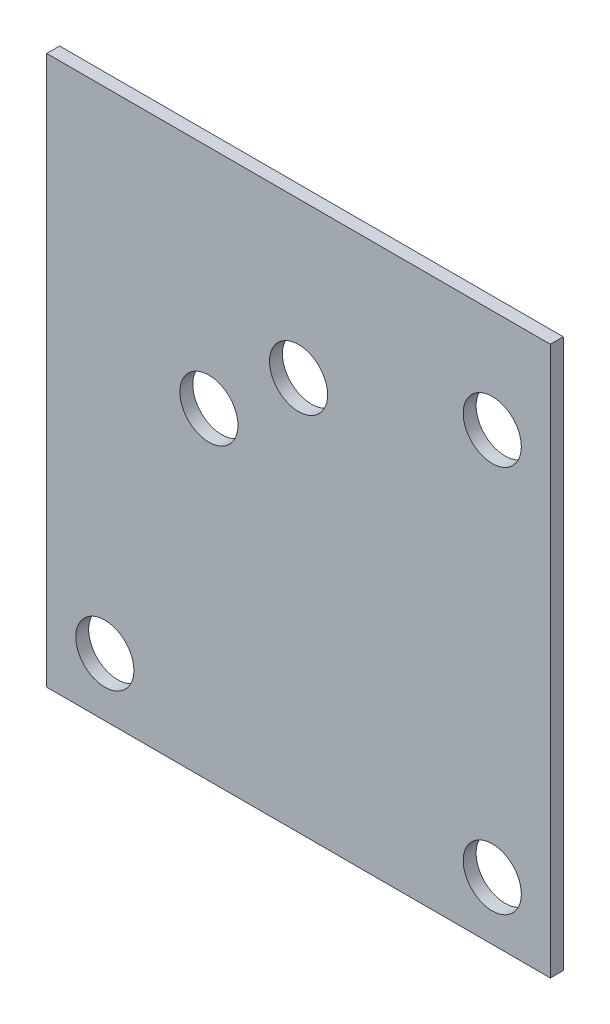
ISO-10303-21;
HEADER;
FILE_DESCRIPTION(('STEP AP214'),'2;1');
FILE_NAME('part.step','',(''),(''),'','','');
FILE_SCHEMA(('AUTOMOTIVE_DESIGN { 1 0 10303 214 1 1 1 1 }'));
ENDSEC;
DATA;
#1=APPLICATION_CONTEXT('core data for automotive mechanical design processes');
#2=APPLICATION_PROTOCOL_DEFINITION('international standard','automotive_design',2000,#1);
#3=PRODUCT_CONTEXT('',#1,'mechanical');
#4=PRODUCT('Part','Part','',(#3));
#5=PRODUCT_RELATED_PRODUCT_CATEGORY('part','',(#4));
#6=PRODUCT_DEFINITION_FORMATION('','',#4);
#7=PRODUCT_DEFINITION_CONTEXT('part definition',#1,'design');
#8=PRODUCT_DEFINITION('design','',#6,#7);
#9=PRODUCT_DEFINITION_SHAPE('','',#8);
#10=(LENGTH_UNIT() NAMED_UNIT(*) SI_UNIT(.MILLI.,.METRE.));
#11=(NAMED_UNIT(*) PLANE_ANGLE_UNIT() SI_UNIT($,.RADIAN.));
#12=(NAMED_UNIT(*) SI_UNIT($,.STERADIAN.) SOLID_ANGLE_UNIT());
#13=UNCERTAINTY_MEASURE_WITH_UNIT(LENGTH_MEASURE(1.E-05),#10,'distance_accuracy_value','');
#14=(GEOMETRIC_REPRESENTATION_CONTEXT(3) GLOBAL_UNCERTAINTY_ASSIGNED_CONTEXT((#13)) GLOBAL_UNIT_ASSIGNED_CONTEXT((#10,
#11,#12)) REPRESENTATION_CONTEXT('',''));
#15=CARTESIAN_POINT('',(0.,0.,0.));
#16=DIRECTION('',(0.,0.,1.));
#17=DIRECTION('',(1.,0.,0.));
#18=AXIS2_PLACEMENT_3D('',#15,#16,#17);
#19=CARTESIAN_POINT('',(0.,0.,6.35));
#20=DIRECTION('',(0.,0.,-1.));
#21=DIRECTION('',(-1.,0.,0.));
#22=AXIS2_PLACEMENT_3D('',#19,#20,#21);
#23=PLANE('',#22);
#24=DIRECTION('',(1.,0.,0.));
#25=VECTOR('',#24,1.);
#26=CARTESIAN_POINT('',(28.5749999999964,-28.575,6.35));
#27=LINE('',#26,#25);
#28=CARTESIAN_POINT('',(-219.075,-28.575,6.35));
#29=VERTEX_POINT('',#28);
#30=CARTESIAN_POINT('',(28.5749999999964,-28.575,6.35));
#31=VERTEX_POINT('',#30);
#32=EDGE_CURVE('E91',#29,#31,#27,.T.);
#33=ORIENTED_EDGE('',*,*,#32,.T.);
#34=DIRECTION('',(0.,1.,0.));
#35=VECTOR('',#34,1.);
#36=CARTESIAN_POINT('',(28.5749999999964,-28.575,6.35));
#37=LINE('',#36,#35);
#38=CARTESIAN_POINT('',(28.5749999999964,241.3,6.35));
#39=VERTEX_POINT('',#38);
#40=EDGE_CURVE('E86',#31,#39,#37,.T.);
#41=ORIENTED_EDGE('',*,*,#40,.T.);
#42=DIRECTION('',(-1.,0.,0.));
#43=VECTOR('',#42,1.);
#44=CARTESIAN_POINT('',(28.5749999999964,241.3,6.35));
#45=LINE('',#44,#43);
#46=CARTESIAN_POINT('',(-219.075,241.3,6.35));
#47=VERTEX_POINT('',#46);
#48=EDGE_CURVE('E89',#39,#47,#45,.T.);
#49=ORIENTED_EDGE('',*,*,#48,.T.);
#50=DIRECTION('',(0.,-1.,0.));
#51=VECTOR('',#50,1.);
#52=CARTESIAN_POINT('',(-219.075,-28.575,6.35));
#53=LINE('',#52,#51);
#54=EDGE_CURVE('E56',#47,#29,#53,.T.);
#55=ORIENTED_EDGE('',*,*,#54,.T.);
#56=EDGE_LOOP('',(#33,#41,#49,#55));
#57=FACE_BOUND('',#56,.T.);
#58=CARTESIAN_POINT('',(0.,0.,6.35));
#59=DIRECTION('',(0.,0.,1.));
#60=DIRECTION('',(1.,0.,0.));
#61=AXIS2_PLACEMENT_3D('',#58,#59,#60);
#62=CIRCLE('',#61,14.2875);
#63=CARTESIAN_POINT('',(14.2875,0.,6.35));
#64=VERTEX_POINT('',#63);
#65=EDGE_CURVE('E106',#64,#64,#62,.T.);
#66=ORIENTED_EDGE('',*,*,#65,.F.);
#67=EDGE_LOOP('',(#66));
#68=FACE_BOUND('',#67,.T.);
#69=CARTESIAN_POINT('',(-190.5,0.,6.35));
#70=DIRECTION('',(0.,0.,1.));
#71=DIRECTION('',(1.,0.,0.));
#72=AXIS2_PLACEMENT_3D('',#69,#70,#71);
#73=CIRCLE('',#72,14.2875);
#74=CARTESIAN_POINT('',(-176.2125,0.,6.35));
#75=VERTEX_POINT('',#74);
#76=EDGE_CURVE('E121',#75,#75,#73,.T.);
#77=ORIENTED_EDGE('',*,*,#76,.F.);
#78=EDGE_LOOP('',(#77));
#79=FACE_BOUND('',#78,.T.);
#80=CARTESIAN_POINT('',(-139.322880158453,129.920687591905,6.35));
#81=DIRECTION('',(0.,0.,1.));
#82=DIRECTION('',(1.,0.,0.));
#83=AXIS2_PLACEMENT_3D('',#80,#81,#82);
#84=CIRCLE('',#83,14.2875);
#85=CARTESIAN_POINT('',(-125.035380158453,129.920687591905,6.35));
#86=VERTEX_POINT('',#85);
#87=EDGE_CURVE('E127',#86,#86,#84,.T.);
#88=ORIENTED_EDGE('',*,*,#87,.F.);
#89=EDGE_LOOP('',(#88));
#90=FACE_BOUND('',#89,.T.);
#91=CARTESIAN_POINT('',(-95.250000000002,164.977839420934,6.35));
#92=DIRECTION('',(0.,0.,1.));
#93=DIRECTION('',(1.,0.,0.));
#94=AXIS2_PLACEMENT_3D('',#91,#92,#93);
#95=CIRCLE('',#94,14.2875);
#96=CARTESIAN_POINT('',(-80.962500000002,164.977839420934,6.35));
#97=VERTEX_POINT('',#96);
#98=EDGE_CURVE('E133',#97,#97,#95,.T.);
#99=ORIENTED_EDGE('',*,*,#98,.F.);
#100=EDGE_LOOP('',(#99));
#101=FACE_BOUND('',#100,.T.);
#102=CARTESIAN_POINT('',(-3.5425828937008E-12,190.5,6.35));
#103=DIRECTION('',(0.,0.,1.));
#104=DIRECTION('',(1.,0.,0.));
#105=AXIS2_PLACEMENT_3D('',#102,#103,#104);
#106=CIRCLE('',#105,14.2875000000001);
#107=CARTESIAN_POINT('',(14.2874999999966,190.5,6.35));
#108=VERTEX_POINT('',#107);
#109=EDGE_CURVE('E139',#108,#108,#106,.T.);
#110=ORIENTED_EDGE('',*,*,#109,.F.);
#111=EDGE_LOOP('',(#110));
#112=FACE_BOUND('',#111,.T.);
#113=ADVANCED_FACE('F39',(#57,#68,#79,#90,#101,#112),#23,.F.);
#114=CARTESIAN_POINT('',(0.,0.,0.));
#115=DIRECTION('',(0.,0.,-1.));
#116=DIRECTION('',(-1.,0.,0.));
#117=AXIS2_PLACEMENT_3D('',#114,#115,#116);
#118=PLANE('',#117);
#119=CARTESIAN_POINT('',(-95.250000000002,164.977839420934,0.));
#120=DIRECTION('',(0.,0.,1.));
#121=DIRECTION('',(1.,0.,0.));
#122=AXIS2_PLACEMENT_3D('',#119,#120,#121);
#123=CIRCLE('',#122,14.2875);
#124=CARTESIAN_POINT('',(-80.962500000002,164.977839420934,0.));
#125=VERTEX_POINT('',#124);
#126=EDGE_CURVE('E136',#125,#125,#123,.T.);
#127=ORIENTED_EDGE('',*,*,#126,.T.);
#128=EDGE_LOOP('',(#127));
#129=FACE_BOUND('',#128,.T.);
#130=CARTESIAN_POINT('',(-190.5,0.,0.));
#131=DIRECTION('',(0.,0.,1.));
#132=DIRECTION('',(1.,0.,0.));
#133=AXIS2_PLACEMENT_3D('',#130,#131,#132);
#134=CIRCLE('',#133,14.2875);
#135=CARTESIAN_POINT('',(-176.2125,0.,0.));
#136=VERTEX_POINT('',#135);
#137=EDGE_CURVE('E124',#136,#136,#134,.T.);
#138=ORIENTED_EDGE('',*,*,#137,.T.);
#139=EDGE_LOOP('',(#138));
#140=FACE_BOUND('',#139,.T.);
#141=DIRECTION('',(1.,0.,0.));
#142=VECTOR('',#141,1.);
#143=CARTESIAN_POINT('',(28.5749999999964,-28.575,0.));
#144=LINE('',#143,#142);
#145=CARTESIAN_POINT('',(-219.075,-28.575,0.));
#146=VERTEX_POINT('',#145);
#147=CARTESIAN_POINT('',(28.5749999999964,-28.575,0.));
#148=VERTEX_POINT('',#147);
#149=EDGE_CURVE('E103',#146,#148,#144,.T.);
#150=ORIENTED_EDGE('',*,*,#149,.F.);
#151=DIRECTION('',(0.,-1.,0.));
#152=VECTOR('',#151,1.);
#153=CARTESIAN_POINT('',(-219.075,-28.575,0.));
#154=LINE('',#153,#152);
#155=CARTESIAN_POINT('',(-219.075,241.3,0.));
#156=VERTEX_POINT('',#155);
#157=EDGE_CURVE('E79',#156,#146,#154,.T.);
#158=ORIENTED_EDGE('',*,*,#157,.F.);
#159=DIRECTION('',(-1.,0.,0.));
#160=VECTOR('',#159,1.);
#161=CARTESIAN_POINT('',(28.5749999999964,241.3,0.));
#162=LINE('',#161,#160);
#163=CARTESIAN_POINT('',(28.5749999999964,241.3,0.));
#164=VERTEX_POINT('',#163);
#165=EDGE_CURVE('E73',#164,#156,#162,.T.);
#166=ORIENTED_EDGE('',*,*,#165,.F.);
#167=DIRECTION('',(0.,1.,0.));
#168=VECTOR('',#167,1.);
#169=CARTESIAN_POINT('',(28.5749999999964,-28.575,0.));
#170=LINE('',#169,#168);
#171=EDGE_CURVE('E95',#148,#164,#170,.T.);
#172=ORIENTED_EDGE('',*,*,#171,.F.);
#173=EDGE_LOOP('',(#150,#158,#166,#172));
#174=FACE_BOUND('',#173,.T.);
#175=CARTESIAN_POINT('',(0.,0.,0.));
#176=DIRECTION('',(0.,0.,1.));
#177=DIRECTION('',(1.,0.,0.));
#178=AXIS2_PLACEMENT_3D('',#175,#176,#177);
#179=CIRCLE('',#178,14.2875);
#180=CARTESIAN_POINT('',(14.2875,0.,0.));
#181=VERTEX_POINT('',#180);
#182=EDGE_CURVE('E118',#181,#181,#179,.T.);
#183=ORIENTED_EDGE('',*,*,#182,.T.);
#184=EDGE_LOOP('',(#183));
#185=FACE_BOUND('',#184,.T.);
#186=CARTESIAN_POINT('',(-139.322880158453,129.920687591905,0.));
#187=DIRECTION('',(0.,0.,1.));
#188=DIRECTION('',(1.,0.,0.));
#189=AXIS2_PLACEMENT_3D('',#186,#187,#188);
#190=CIRCLE('',#189,14.2875);
#191=CARTESIAN_POINT('',(-125.035380158453,129.920687591905,0.));
#192=VERTEX_POINT('',#191);
#193=EDGE_CURVE('E130',#192,#192,#190,.T.);
#194=ORIENTED_EDGE('',*,*,#193,.T.);
#195=EDGE_LOOP('',(#194));
#196=FACE_BOUND('',#195,.T.);
#197=CARTESIAN_POINT('',(-3.5425828937008E-12,190.5,0.));
#198=DIRECTION('',(0.,0.,1.));
#199=DIRECTION('',(1.,0.,0.));
#200=AXIS2_PLACEMENT_3D('',#197,#198,#199);
#201=CIRCLE('',#200,14.2875000000001);
#202=CARTESIAN_POINT('',(14.2874999999966,190.5,0.));
#203=VERTEX_POINT('',#202);
#204=EDGE_CURVE('E142',#203,#203,#201,.T.);
#205=ORIENTED_EDGE('',*,*,#204,.T.);
#206=EDGE_LOOP('',(#205));
#207=FACE_BOUND('',#206,.T.);
#208=ADVANCED_FACE('F114',(#129,#140,#174,#185,#196,#207),#118,.T.);
#209=CARTESIAN_POINT('',(28.5749999999964,-28.575,6.35));
#210=DIRECTION('',(0.,1.,0.));
#211=DIRECTION('',(-1.,0.,0.));
#212=AXIS2_PLACEMENT_3D('',#209,#210,#211);
#213=PLANE('',#212);
#214=ORIENTED_EDGE('',*,*,#149,.T.);
#215=DIRECTION('',(0.,0.,-1.));
#216=VECTOR('',#215,1.);
#217=CARTESIAN_POINT('',(28.5749999999964,-28.575,6.35));
#218=LINE('',#217,#216);
#219=EDGE_CURVE('E11',#31,#148,#218,.T.);
#220=ORIENTED_EDGE('',*,*,#219,.F.);
#221=ORIENTED_EDGE('',*,*,#32,.F.);
#222=DIRECTION('',(0.,0.,-1.));
#223=VECTOR('',#222,1.);
#224=CARTESIAN_POINT('',(-219.075,-28.575,6.35));
#225=LINE('',#224,#223);
#226=EDGE_CURVE('E99',#29,#146,#225,.T.);
#227=ORIENTED_EDGE('',*,*,#226,.T.);
#228=EDGE_LOOP('',(#214,#220,#221,#227));
#229=FACE_BOUND('',#228,.T.);
#230=ADVANCED_FACE('F41',(#229),#213,.F.);
#231=CARTESIAN_POINT('',(28.5749999999964,-28.575,6.35));
#232=DIRECTION('',(-1.,0.,0.));
#233=DIRECTION('',(0.,0.,1.));
#234=AXIS2_PLACEMENT_3D('',#231,#232,#233);
#235=PLANE('',#234);
#236=ORIENTED_EDGE('',*,*,#171,.T.);
#237=DIRECTION('',(0.,0.,-1.));
#238=VECTOR('',#237,1.);
#239=CARTESIAN_POINT('',(28.5749999999964,241.3,6.35));
#240=LINE('',#239,#238);
#241=EDGE_CURVE('E48',#39,#164,#240,.T.);
#242=ORIENTED_EDGE('',*,*,#241,.F.);
#243=ORIENTED_EDGE('',*,*,#40,.F.);
#244=ORIENTED_EDGE('',*,*,#219,.T.);
#245=EDGE_LOOP('',(#236,#242,#243,#244));
#246=FACE_BOUND('',#245,.T.);
#247=ADVANCED_FACE('F94',(#246),#235,.F.);
#248=CARTESIAN_POINT('',(28.5749999999964,241.3,6.35));
#249=DIRECTION('',(0.,-1.,0.));
#250=DIRECTION('',(1.,0.,0.));
#251=AXIS2_PLACEMENT_3D('',#248,#249,#250);
#252=PLANE('',#251);
#253=ORIENTED_EDGE('',*,*,#165,.T.);
#254=DIRECTION('',(0.,0.,-1.));
#255=VECTOR('',#254,1.);
#256=CARTESIAN_POINT('',(-219.075,241.3,6.35));
#257=LINE('',#256,#255);
#258=EDGE_CURVE('E96',#47,#156,#257,.T.);
#259=ORIENTED_EDGE('',*,*,#258,.F.);
#260=ORIENTED_EDGE('',*,*,#48,.F.);
#261=ORIENTED_EDGE('',*,*,#241,.T.);
#262=EDGE_LOOP('',(#253,#259,#260,#261));
#263=FACE_BOUND('',#262,.T.);
#264=ADVANCED_FACE('F97',(#263),#252,.F.);
#265=CARTESIAN_POINT('',(-219.075,-28.575,6.35));
#266=DIRECTION('',(1.,0.,0.));
#267=DIRECTION('',(0.,1.,0.));
#268=AXIS2_PLACEMENT_3D('',#265,#266,#267);
#269=PLANE('',#268);
#270=ORIENTED_EDGE('',*,*,#157,.T.);
#271=ORIENTED_EDGE('',*,*,#226,.F.);
#272=ORIENTED_EDGE('',*,*,#54,.F.);
#273=ORIENTED_EDGE('',*,*,#258,.T.);
#274=EDGE_LOOP('',(#270,#271,#272,#273));
#275=FACE_BOUND('',#274,.T.);
#276=ADVANCED_FACE('F111',(#275),#269,.F.);
#277=CARTESIAN_POINT('',(0.,0.,6.35));
#278=DIRECTION('',(0.,0.,-1.));
#279=DIRECTION('',(-1.,0.,0.));
#280=AXIS2_PLACEMENT_3D('',#277,#278,#279);
#281=CYLINDRICAL_SURFACE('',#280,14.2875);
#282=ORIENTED_EDGE('',*,*,#65,.T.);
#283=EDGE_LOOP('',(#282));
#284=FACE_BOUND('',#283,.T.);
#285=ORIENTED_EDGE('',*,*,#182,.F.);
#286=EDGE_LOOP('',(#285));
#287=FACE_BOUND('',#286,.T.);
#288=ADVANCED_FACE('F159',(#284,#287),#281,.F.);
#289=CARTESIAN_POINT('',(-190.5,0.,6.35));
#290=DIRECTION('',(0.,0.,-1.));
#291=DIRECTION('',(-1.,0.,0.));
#292=AXIS2_PLACEMENT_3D('',#289,#290,#291);
#293=CYLINDRICAL_SURFACE('',#292,14.2875);
#294=ORIENTED_EDGE('',*,*,#76,.T.);
#295=EDGE_LOOP('',(#294));
#296=FACE_BOUND('',#295,.T.);
#297=ORIENTED_EDGE('',*,*,#137,.F.);
#298=EDGE_LOOP('',(#297));
#299=FACE_BOUND('',#298,.T.);
#300=ADVANCED_FACE('F204',(#296,#299),#293,.F.);
#301=CARTESIAN_POINT('',(-139.322880158453,129.920687591905,6.35));
#302=DIRECTION('',(0.,0.,-1.));
#303=DIRECTION('',(-1.,0.,0.));
#304=AXIS2_PLACEMENT_3D('',#301,#302,#303);
#305=CYLINDRICAL_SURFACE('',#304,14.2875);
#306=ORIENTED_EDGE('',*,*,#87,.T.);
#307=EDGE_LOOP('',(#306));
#308=FACE_BOUND('',#307,.T.);
#309=ORIENTED_EDGE('',*,*,#193,.F.);
#310=EDGE_LOOP('',(#309));
#311=FACE_BOUND('',#310,.T.);
#312=ADVANCED_FACE('F212',(#308,#311),#305,.F.);
#313=CARTESIAN_POINT('',(-95.250000000002,164.977839420934,6.35));
#314=DIRECTION('',(0.,0.,-1.));
#315=DIRECTION('',(-1.,0.,0.));
#316=AXIS2_PLACEMENT_3D('',#313,#314,#315);
#317=CYLINDRICAL_SURFACE('',#316,14.2875);
#318=ORIENTED_EDGE('',*,*,#98,.T.);
#319=EDGE_LOOP('',(#318));
#320=FACE_BOUND('',#319,.T.);
#321=ORIENTED_EDGE('',*,*,#126,.F.);
#322=EDGE_LOOP('',(#321));
#323=FACE_BOUND('',#322,.T.);
#324=ADVANCED_FACE('F220',(#320,#323),#317,.F.);
#325=CARTESIAN_POINT('',(-3.5425828937008E-12,190.5,6.35));
#326=DIRECTION('',(0.,0.,-1.));
#327=DIRECTION('',(-1.,0.,0.));
#328=AXIS2_PLACEMENT_3D('',#325,#326,#327);
#329=CYLINDRICAL_SURFACE('',#328,14.2875000000001);
#330=ORIENTED_EDGE('',*,*,#109,.T.);
#331=EDGE_LOOP('',(#330));
#332=FACE_BOUND('',#331,.T.);
#333=ORIENTED_EDGE('',*,*,#204,.F.);
#334=EDGE_LOOP('',(#333));
#335=FACE_BOUND('',#334,.T.);
#336=ADVANCED_FACE('F148',(#332,#335),#329,.F.);
#337=CLOSED_SHELL('',(#113,#208,#230,#247,#264,#276,#288,#300,#312,#324,#336));
#338=MANIFOLD_SOLID_BREP('B2',#337);
#339=ADVANCED_BREP_SHAPE_REPRESENTATION('',(#18,#338),#14);
#340=SHAPE_DEFINITION_REPRESENTATION(#9,#339);
ENDSEC;
END-ISO-10303-21;
